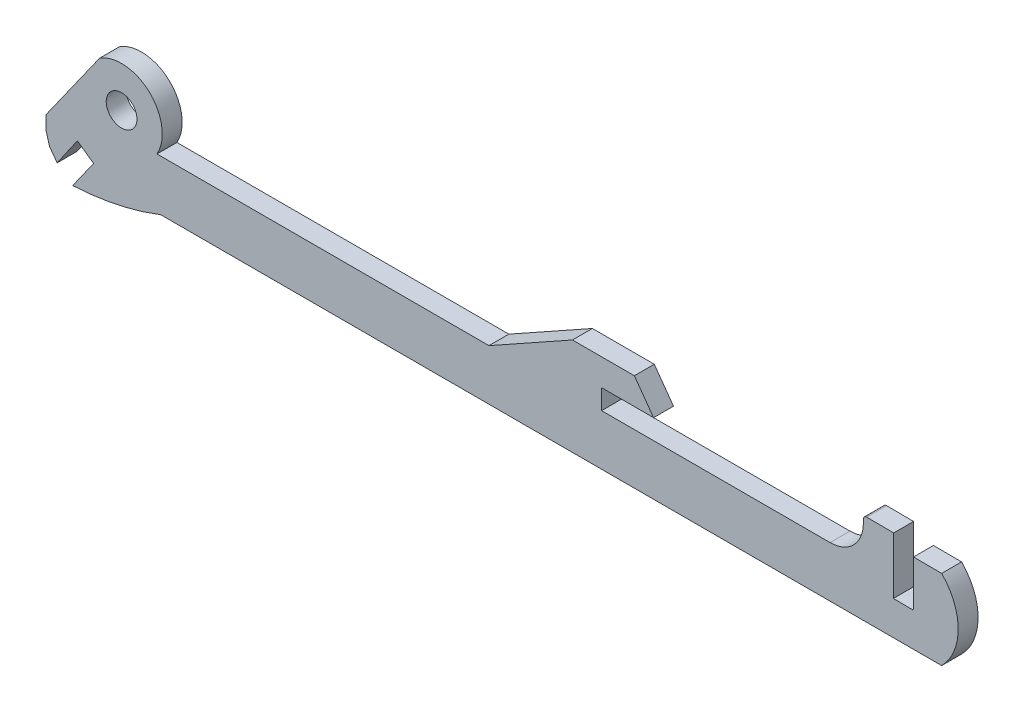
ISO-10303-21;
HEADER;
FILE_DESCRIPTION(('STEP AP214'),'2;1');
FILE_NAME('part.step','',(''),(''),'','','');
FILE_SCHEMA(('AUTOMOTIVE_DESIGN { 1 0 10303 214 1 1 1 1 }'));
ENDSEC;
DATA;
#1=APPLICATION_CONTEXT('core data for automotive mechanical design processes');
#2=APPLICATION_PROTOCOL_DEFINITION('international standard','automotive_design',2000,#1);
#3=PRODUCT_CONTEXT('',#1,'mechanical');
#4=PRODUCT('Part','Part','',(#3));
#5=PRODUCT_RELATED_PRODUCT_CATEGORY('part','',(#4));
#6=PRODUCT_DEFINITION_FORMATION('','',#4);
#7=PRODUCT_DEFINITION_CONTEXT('part definition',#1,'design');
#8=PRODUCT_DEFINITION('design','',#6,#7);
#9=PRODUCT_DEFINITION_SHAPE('','',#8);
#10=(LENGTH_UNIT() NAMED_UNIT(*) SI_UNIT(.MILLI.,.METRE.));
#11=(NAMED_UNIT(*) PLANE_ANGLE_UNIT() SI_UNIT($,.RADIAN.));
#12=(NAMED_UNIT(*) SI_UNIT($,.STERADIAN.) SOLID_ANGLE_UNIT());
#13=UNCERTAINTY_MEASURE_WITH_UNIT(LENGTH_MEASURE(1.E-05),#10,'distance_accuracy_value','');
#14=(GEOMETRIC_REPRESENTATION_CONTEXT(3) GLOBAL_UNCERTAINTY_ASSIGNED_CONTEXT((#13)) GLOBAL_UNIT_ASSIGNED_CONTEXT((#10,
#11,#12)) REPRESENTATION_CONTEXT('',''));
#15=CARTESIAN_POINT('',(0.,0.,0.));
#16=DIRECTION('',(0.,0.,1.));
#17=DIRECTION('',(1.,0.,0.));
#18=AXIS2_PLACEMENT_3D('',#15,#16,#17);
#19=CARTESIAN_POINT('',(1249.29913279827,-100.717822078419,3.));
#20=DIRECTION('',(0.,0.,-1.));
#21=DIRECTION('',(-1.,0.,0.));
#22=AXIS2_PLACEMENT_3D('',#19,#20,#21);
#23=PLANE('',#22);
#24=DIRECTION('',(0.00562127235781514,-0.999984200523728,0.));
#25=VECTOR('',#24,1.);
#26=CARTESIAN_POINT('',(1237.9238014744,-109.055713836434,3.));
#27=LINE('',#26,#25);
#28=CARTESIAN_POINT('',(1237.91205130226,-106.96544214322,3.));
#29=VERTEX_POINT('',#28);
#30=CARTESIAN_POINT('',(1237.9238014744,-109.055713836434,3.));
#31=VERTEX_POINT('',#30);
#32=EDGE_CURVE('E286',#29,#31,#27,.T.);
#33=ORIENTED_EDGE('',*,*,#32,.T.);
#34=DIRECTION('',(0.281544310526475,-0.959548227662462,0.));
#35=VECTOR('',#34,1.);
#36=CARTESIAN_POINT('',(1238.46032272712,-110.884264433615,3.));
#37=LINE('',#36,#35);
#38=CARTESIAN_POINT('',(1238.46032272712,-110.884264433615,3.));
#39=VERTEX_POINT('',#38);
#40=EDGE_CURVE('E225',#31,#39,#37,.T.);
#41=ORIENTED_EDGE('',*,*,#40,.T.);
#42=DIRECTION('',(0.594148336046172,-0.80435549029864,0.));
#43=VECTOR('',#42,1.);
#44=CARTESIAN_POINT('',(1239.59169644422,-112.415913359857,3.));
#45=LINE('',#44,#43);
#46=CARTESIAN_POINT('',(1239.59169644422,-112.415913359857,3.));
#47=VERTEX_POINT('',#46);
#48=EDGE_CURVE('E289',#39,#47,#45,.T.);
#49=ORIENTED_EDGE('',*,*,#48,.T.);
#50=DIRECTION('',(0.568869517770941,0.82242779120787,0.));
#51=VECTOR('',#50,1.);
#52=CARTESIAN_POINT('',(1242.63666962349,-108.013725357363,3.));
#53=LINE('',#52,#51);
#54=CARTESIAN_POINT('',(1242.63666962349,-108.013725357363,3.));
#55=VERTEX_POINT('',#54);
#56=EDGE_CURVE('E291',#47,#55,#53,.T.);
#57=ORIENTED_EDGE('',*,*,#56,.T.);
#58=DIRECTION('',(0.81647452991787,-0.57738145276359,0.));
#59=VECTOR('',#58,1.);
#60=CARTESIAN_POINT('',(1245.08609321325,-109.745869715654,3.));
#61=LINE('',#60,#59);
#62=CARTESIAN_POINT('',(1245.08609321325,-109.745869715654,3.));
#63=VERTEX_POINT('',#62);
#64=EDGE_CURVE('E293',#55,#63,#61,.T.);
#65=ORIENTED_EDGE('',*,*,#64,.T.);
#66=DIRECTION('',(-0.577381452763583,-0.816474529917874,0.));
#67=VECTOR('',#66,1.);
#68=CARTESIAN_POINT('',(1241.93611115172,-114.200256171309,3.));
#69=LINE('',#68,#67);
#70=CARTESIAN_POINT('',(1241.93611115172,-114.200256171309,3.));
#71=VERTEX_POINT('',#70);
#72=EDGE_CURVE('E295',#63,#71,#69,.T.);
#73=ORIENTED_EDGE('',*,*,#72,.T.);
#74=CARTESIAN_POINT('',(1240.12442524358,-73.1446000820579,3.));
#75=DIRECTION('',(0.,0.,1.));
#76=DIRECTION('',(-1.,0.,0.));
#77=AXIS2_PLACEMENT_3D('',#74,#75,#76);
#78=CIRCLE('',#77,41.0956092879596);
#79=CARTESIAN_POINT('',(1255.17955346671,-111.383222140571,3.));
#80=VERTEX_POINT('',#79);
#81=EDGE_CURVE('E297',#71,#80,#78,.T.);
#82=ORIENTED_EDGE('',*,*,#81,.T.);
#83=DIRECTION('',(1.,0.,0.));
#84=VECTOR('',#83,1.);
#85=CARTESIAN_POINT('',(1372.85593511088,-111.383222140572,3.));
#86=LINE('',#85,#84);
#87=CARTESIAN_POINT('',(1372.85593511088,-111.383222140572,3.));
#88=VERTEX_POINT('',#87);
#89=EDGE_CURVE('E299',#80,#88,#86,.T.);
#90=ORIENTED_EDGE('',*,*,#89,.T.);
#91=CARTESIAN_POINT('',(1366.83954740942,-105.36638446055,3.));
#92=DIRECTION('',(0.,0.,1.));
#93=DIRECTION('',(-1.,0.,0.));
#94=AXIS2_PLACEMENT_3D('',#91,#92,#93);
#95=CIRCLE('',#94,8.50877527273733);
#96=CARTESIAN_POINT('',(1372.85638508944,-99.3499967590952,3.));
#97=VERTEX_POINT('',#96);
#98=EDGE_CURVE('E301',#88,#97,#95,.T.);
#99=ORIENTED_EDGE('',*,*,#98,.T.);
#100=DIRECTION('',(-0.999980087028899,0.00631074842441065,0.));
#101=VECTOR('',#100,1.);
#102=CARTESIAN_POINT('',(1368.62014239532,-99.3232623648266,3.));
#103=LINE('',#102,#101);
#104=CARTESIAN_POINT('',(1368.62014239532,-99.3232623648266,3.));
#105=VERTEX_POINT('',#104);
#106=EDGE_CURVE('E303',#97,#105,#103,.T.);
#107=ORIENTED_EDGE('',*,*,#106,.T.);
#108=DIRECTION('',(-0.0063107484244119,-0.999980087028899,0.));
#109=VECTOR('',#108,1.);
#110=CARTESIAN_POINT('',(1368.62014239532,-99.3232623648266,3.));
#111=LINE('',#110,#109);
#112=CARTESIAN_POINT('',(1368.57623781168,-106.280235834852,3.));
#113=VERTEX_POINT('',#112);
#114=EDGE_CURVE('E305',#105,#113,#111,.T.);
#115=ORIENTED_EDGE('',*,*,#114,.T.);
#116=DIRECTION('',(-0.999980087028899,0.00631074842441552,0.));
#117=VECTOR('',#116,1.);
#118=CARTESIAN_POINT('',(1365.57623781168,-106.261303212574,3.));
#119=LINE('',#118,#117);
#120=CARTESIAN_POINT('',(1365.57623781168,-106.261303212574,3.));
#121=VERTEX_POINT('',#120);
#122=EDGE_CURVE('E307',#113,#121,#119,.T.);
#123=ORIENTED_EDGE('',*,*,#122,.T.);
#124=DIRECTION('',(0.00631074842442426,0.999980087028899,0.));
#125=VECTOR('',#124,1.);
#126=CARTESIAN_POINT('',(1365.63036840998,-97.6839496630379,3.));
#127=LINE('',#126,#125);
#128=CARTESIAN_POINT('',(1365.63036840998,-97.6839496630379,3.));
#129=VERTEX_POINT('',#128);
#130=EDGE_CURVE('E309',#121,#129,#127,.T.);
#131=ORIENTED_EDGE('',*,*,#130,.T.);
#132=DIRECTION('',(-0.999980087028899,0.00631074842441526,0.));
#133=VECTOR('',#132,1.);
#134=CARTESIAN_POINT('',(1361.56568395741,-97.6582979512313,3.));
#135=LINE('',#134,#133);
#136=CARTESIAN_POINT('',(1361.56568395741,-97.6582979512312,3.));
#137=VERTEX_POINT('',#136);
#138=EDGE_CURVE('E311',#129,#137,#135,.T.);
#139=ORIENTED_EDGE('',*,*,#138,.T.);
#140=CARTESIAN_POINT('',(1361.5625285832,-98.1582879947458,3.));
#141=DIRECTION('',(0.,0.,1.));
#142=DIRECTION('',(-1.,0.,0.));
#143=AXIS2_PLACEMENT_3D('',#140,#141,#142);
#144=CIRCLE('',#143,0.500000000000082);
#145=CARTESIAN_POINT('',(1361.0625285832,-98.1582879947458,3.));
#146=VERTEX_POINT('',#145);
#147=EDGE_CURVE('E313',#137,#146,#144,.T.);
#148=ORIENTED_EDGE('',*,*,#147,.T.);
#149=DIRECTION('',(0.,-1.,0.));
#150=VECTOR('',#149,1.);
#151=CARTESIAN_POINT('',(1361.0625285832,-98.4776898423774,3.));
#152=LINE('',#151,#150);
#153=CARTESIAN_POINT('',(1361.0625285832,-98.4776898423774,3.));
#154=VERTEX_POINT('',#153);
#155=EDGE_CURVE('E315',#146,#154,#152,.T.);
#156=ORIENTED_EDGE('',*,*,#155,.T.);
#157=DIRECTION('',(-0.0379292699595428,-0.999280426347047,0.));
#158=VECTOR('',#157,1.);
#159=CARTESIAN_POINT('',(1361.04558813768,-98.9240009800915,3.));
#160=LINE('',#159,#158);
#161=CARTESIAN_POINT('',(1361.04558813768,-98.9240009800915,3.));
#162=VERTEX_POINT('',#161);
#163=EDGE_CURVE('E317',#154,#162,#160,.T.);
#164=ORIENTED_EDGE('',*,*,#163,.T.);
#165=CARTESIAN_POINT('',(1356.04918600594,-98.734354630292,3.));
#166=DIRECTION('',(0.,0.,-1.));
#167=DIRECTION('',(1.,0.,0.));
#168=AXIS2_PLACEMENT_3D('',#165,#166,#167);
#169=CIRCLE('',#168,5.00000000000004);
#170=CARTESIAN_POINT('',(1356.04918600594,-103.734354630292,3.));
#171=VERTEX_POINT('',#170);
#172=EDGE_CURVE('E319',#162,#171,#169,.T.);
#173=ORIENTED_EDGE('',*,*,#172,.T.);
#174=DIRECTION('',(-1.,0.,0.));
#175=VECTOR('',#174,1.);
#176=CARTESIAN_POINT('',(1321.62054351915,-103.734354630292,3.));
#177=LINE('',#176,#175);
#178=CARTESIAN_POINT('',(1321.62054351915,-103.734354630292,3.));
#179=VERTEX_POINT('',#178);
#180=EDGE_CURVE('E321',#171,#179,#177,.T.);
#181=ORIENTED_EDGE('',*,*,#180,.T.);
#182=DIRECTION('',(0.,1.,0.));
#183=VECTOR('',#182,1.);
#184=CARTESIAN_POINT('',(1321.62054351915,-100.734354630292,3.));
#185=LINE('',#184,#183);
#186=CARTESIAN_POINT('',(1321.62054351915,-100.734354630292,3.));
#187=VERTEX_POINT('',#186);
#188=EDGE_CURVE('E323',#179,#187,#185,.T.);
#189=ORIENTED_EDGE('',*,*,#188,.T.);
#190=DIRECTION('',(1.,0.,0.));
#191=VECTOR('',#190,1.);
#192=CARTESIAN_POINT('',(1329.4523890128,-100.734354630292,3.));
#193=LINE('',#192,#191);
#194=CARTESIAN_POINT('',(1329.4523890128,-100.734354630292,3.));
#195=VERTEX_POINT('',#194);
#196=EDGE_CURVE('E325',#187,#195,#193,.T.);
#197=ORIENTED_EDGE('',*,*,#196,.T.);
#198=DIRECTION('',(-0.583216661111153,0.812316641588954,0.));
#199=VECTOR('',#198,1.);
#200=CARTESIAN_POINT('',(1326.56081780387,-96.7069123948891,3.));
#201=LINE('',#200,#199);
#202=CARTESIAN_POINT('',(1326.56081780387,-96.7069123948891,3.));
#203=VERTEX_POINT('',#202);
#204=EDGE_CURVE('E327',#195,#203,#201,.T.);
#205=ORIENTED_EDGE('',*,*,#204,.T.);
#206=DIRECTION('',(-1.,0.,0.));
#207=VECTOR('',#206,1.);
#208=CARTESIAN_POINT('',(1317.22732187553,-96.7069123948894,3.));
#209=LINE('',#208,#207);
#210=CARTESIAN_POINT('',(1317.22732187553,-96.7069123948894,3.));
#211=VERTEX_POINT('',#210);
#212=EDGE_CURVE('E329',#203,#211,#209,.T.);
#213=ORIENTED_EDGE('',*,*,#212,.T.);
#214=DIRECTION('',(-0.872913314261698,-0.487875338364892,0.));
#215=VECTOR('',#214,1.);
#216=CARTESIAN_POINT('',(1304.65372487215,-103.734354630292,3.));
#217=LINE('',#216,#215);
#218=CARTESIAN_POINT('',(1304.65372487215,-103.734354630292,3.));
#219=VERTEX_POINT('',#218);
#220=EDGE_CURVE('E331',#211,#219,#217,.T.);
#221=ORIENTED_EDGE('',*,*,#220,.T.);
#222=DIRECTION('',(-1.,0.,0.));
#223=VECTOR('',#222,1.);
#224=CARTESIAN_POINT('',(1254.63436473097,-103.734354630292,3.));
#225=LINE('',#224,#223);
#226=CARTESIAN_POINT('',(1254.63436473097,-103.734354630292,3.));
#227=VERTEX_POINT('',#226);
#228=EDGE_CURVE('E333',#219,#227,#225,.T.);
#229=ORIENTED_EDGE('',*,*,#228,.T.);
#230=CARTESIAN_POINT('',(1249.29913279827,-100.717822078419,3.));
#231=DIRECTION('',(0.,0.,1.));
#232=DIRECTION('',(-1.,0.,0.));
#233=AXIS2_PLACEMENT_3D('',#230,#231,#232);
#234=CIRCLE('',#233,6.12896144646709);
#235=CARTESIAN_POINT('',(1245.98749698581,-95.5605711966088,3.));
#236=VERTEX_POINT('',#235);
#237=EDGE_CURVE('E52',#227,#236,#234,.T.);
#238=ORIENTED_EDGE('',*,*,#237,.T.);
#239=DIRECTION('',(-0.577874160731018,-0.816125881441963,0.));
#240=VECTOR('',#239,1.);
#241=CARTESIAN_POINT('',(1237.91205130226,-106.96544214322,3.));
#242=LINE('',#241,#240);
#243=EDGE_CURVE('E47',#236,#29,#242,.T.);
#244=ORIENTED_EDGE('',*,*,#243,.T.);
#245=EDGE_LOOP('',(#33,#41,#49,#57,#65,#73,#82,#90,#99,#107,#115,#123,#131,#139,#148,#156,#164,
#173,#181,#189,#197,#205,#213,#221,#229,#238,#244));
#246=FACE_BOUND('',#245,.T.);
#247=CARTESIAN_POINT('',(1249.29913279827,-100.717822078419,3.));
#248=DIRECTION('',(0.,0.,1.));
#249=DIRECTION('',(1.,0.,0.));
#250=AXIS2_PLACEMENT_3D('',#247,#248,#249);
#251=CIRCLE('',#250,2.31465382685576);
#252=CARTESIAN_POINT('',(1251.61378662512,-100.717822078419,3.));
#253=VERTEX_POINT('',#252);
#254=EDGE_CURVE('E230',#253,#253,#251,.T.);
#255=ORIENTED_EDGE('',*,*,#254,.F.);
#256=EDGE_LOOP('',(#255));
#257=FACE_BOUND('',#256,.T.);
#258=ADVANCED_FACE('F32',(#246,#257),#23,.F.);
#259=CARTESIAN_POINT('',(1249.29913279827,-100.717822078419,0.));
#260=DIRECTION('',(0.,0.,-1.));
#261=DIRECTION('',(-1.,0.,0.));
#262=AXIS2_PLACEMENT_3D('',#259,#260,#261);
#263=PLANE('',#262);
#264=DIRECTION('',(0.00562127235781514,-0.999984200523728,0.));
#265=VECTOR('',#264,1.);
#266=CARTESIAN_POINT('',(1237.9238014744,-109.055713836434,0.));
#267=LINE('',#266,#265);
#268=CARTESIAN_POINT('',(1237.91205130226,-106.96544214322,0.));
#269=VERTEX_POINT('',#268);
#270=CARTESIAN_POINT('',(1237.9238014744,-109.055713836434,0.));
#271=VERTEX_POINT('',#270);
#272=EDGE_CURVE('E216',#269,#271,#267,.T.);
#273=ORIENTED_EDGE('',*,*,#272,.F.);
#274=DIRECTION('',(-0.577874160731018,-0.816125881441963,0.));
#275=VECTOR('',#274,1.);
#276=CARTESIAN_POINT('',(1237.91205130226,-106.96544214322,0.));
#277=LINE('',#276,#275);
#278=CARTESIAN_POINT('',(1245.98749698581,-95.5605711966088,0.));
#279=VERTEX_POINT('',#278);
#280=EDGE_CURVE('E284',#279,#269,#277,.T.);
#281=ORIENTED_EDGE('',*,*,#280,.F.);
#282=CARTESIAN_POINT('',(1249.29913279827,-100.717822078419,0.));
#283=DIRECTION('',(0.,0.,1.));
#284=DIRECTION('',(-1.,0.,0.));
#285=AXIS2_PLACEMENT_3D('',#282,#283,#284);
#286=CIRCLE('',#285,6.12896144646709);
#287=CARTESIAN_POINT('',(1254.63436473097,-103.734354630292,0.));
#288=VERTEX_POINT('',#287);
#289=EDGE_CURVE('E282',#288,#279,#286,.T.);
#290=ORIENTED_EDGE('',*,*,#289,.F.);
#291=DIRECTION('',(-1.,0.,0.));
#292=VECTOR('',#291,1.);
#293=CARTESIAN_POINT('',(1254.63436473097,-103.734354630292,0.));
#294=LINE('',#293,#292);
#295=CARTESIAN_POINT('',(1304.65372487215,-103.734354630292,0.));
#296=VERTEX_POINT('',#295);
#297=EDGE_CURVE('E280',#296,#288,#294,.T.);
#298=ORIENTED_EDGE('',*,*,#297,.F.);
#299=DIRECTION('',(-0.872913314261698,-0.487875338364892,0.));
#300=VECTOR('',#299,1.);
#301=CARTESIAN_POINT('',(1304.65372487215,-103.734354630292,0.));
#302=LINE('',#301,#300);
#303=CARTESIAN_POINT('',(1317.22732187553,-96.7069123948894,0.));
#304=VERTEX_POINT('',#303);
#305=EDGE_CURVE('E278',#304,#296,#302,.T.);
#306=ORIENTED_EDGE('',*,*,#305,.F.);
#307=DIRECTION('',(-1.,0.,0.));
#308=VECTOR('',#307,1.);
#309=CARTESIAN_POINT('',(1317.22732187553,-96.7069123948894,0.));
#310=LINE('',#309,#308);
#311=CARTESIAN_POINT('',(1326.56081780387,-96.7069123948891,0.));
#312=VERTEX_POINT('',#311);
#313=EDGE_CURVE('E276',#312,#304,#310,.T.);
#314=ORIENTED_EDGE('',*,*,#313,.F.);
#315=DIRECTION('',(-0.583216661111153,0.812316641588954,0.));
#316=VECTOR('',#315,1.);
#317=CARTESIAN_POINT('',(1326.56081780387,-96.7069123948891,0.));
#318=LINE('',#317,#316);
#319=CARTESIAN_POINT('',(1329.4523890128,-100.734354630292,0.));
#320=VERTEX_POINT('',#319);
#321=EDGE_CURVE('E274',#320,#312,#318,.T.);
#322=ORIENTED_EDGE('',*,*,#321,.F.);
#323=DIRECTION('',(1.,0.,0.));
#324=VECTOR('',#323,1.);
#325=CARTESIAN_POINT('',(1329.4523890128,-100.734354630292,0.));
#326=LINE('',#325,#324);
#327=CARTESIAN_POINT('',(1321.62054351915,-100.734354630292,0.));
#328=VERTEX_POINT('',#327);
#329=EDGE_CURVE('E272',#328,#320,#326,.T.);
#330=ORIENTED_EDGE('',*,*,#329,.F.);
#331=DIRECTION('',(0.,1.,0.));
#332=VECTOR('',#331,1.);
#333=CARTESIAN_POINT('',(1321.62054351915,-100.734354630292,0.));
#334=LINE('',#333,#332);
#335=CARTESIAN_POINT('',(1321.62054351915,-103.734354630292,0.));
#336=VERTEX_POINT('',#335);
#337=EDGE_CURVE('E270',#336,#328,#334,.T.);
#338=ORIENTED_EDGE('',*,*,#337,.F.);
#339=DIRECTION('',(-1.,0.,0.));
#340=VECTOR('',#339,1.);
#341=CARTESIAN_POINT('',(1321.62054351915,-103.734354630292,0.));
#342=LINE('',#341,#340);
#343=CARTESIAN_POINT('',(1356.04918600594,-103.734354630292,0.));
#344=VERTEX_POINT('',#343);
#345=EDGE_CURVE('E268',#344,#336,#342,.T.);
#346=ORIENTED_EDGE('',*,*,#345,.F.);
#347=CARTESIAN_POINT('',(1356.04918600594,-98.734354630292,0.));
#348=DIRECTION('',(0.,0.,-1.));
#349=DIRECTION('',(1.,0.,0.));
#350=AXIS2_PLACEMENT_3D('',#347,#348,#349);
#351=CIRCLE('',#350,5.00000000000004);
#352=CARTESIAN_POINT('',(1361.04558813768,-98.9240009800915,0.));
#353=VERTEX_POINT('',#352);
#354=EDGE_CURVE('E266',#353,#344,#351,.T.);
#355=ORIENTED_EDGE('',*,*,#354,.F.);
#356=DIRECTION('',(-0.0379292699595428,-0.999280426347047,0.));
#357=VECTOR('',#356,1.);
#358=CARTESIAN_POINT('',(1361.04558813768,-98.9240009800915,0.));
#359=LINE('',#358,#357);
#360=CARTESIAN_POINT('',(1361.0625285832,-98.4776898423774,0.));
#361=VERTEX_POINT('',#360);
#362=EDGE_CURVE('E264',#361,#353,#359,.T.);
#363=ORIENTED_EDGE('',*,*,#362,.F.);
#364=DIRECTION('',(0.,-1.,0.));
#365=VECTOR('',#364,1.);
#366=CARTESIAN_POINT('',(1361.0625285832,-98.4776898423774,0.));
#367=LINE('',#366,#365);
#368=CARTESIAN_POINT('',(1361.0625285832,-98.1582879947458,0.));
#369=VERTEX_POINT('',#368);
#370=EDGE_CURVE('E262',#369,#361,#367,.T.);
#371=ORIENTED_EDGE('',*,*,#370,.F.);
#372=CARTESIAN_POINT('',(1361.5625285832,-98.1582879947458,0.));
#373=DIRECTION('',(0.,0.,1.));
#374=DIRECTION('',(-1.,0.,0.));
#375=AXIS2_PLACEMENT_3D('',#372,#373,#374);
#376=CIRCLE('',#375,0.500000000000082);
#377=CARTESIAN_POINT('',(1361.56568395741,-97.6582979512312,0.));
#378=VERTEX_POINT('',#377);
#379=EDGE_CURVE('E260',#378,#369,#376,.T.);
#380=ORIENTED_EDGE('',*,*,#379,.F.);
#381=DIRECTION('',(-0.999980087028899,0.00631074842441526,0.));
#382=VECTOR('',#381,1.);
#383=CARTESIAN_POINT('',(1361.56568395741,-97.6582979512313,0.));
#384=LINE('',#383,#382);
#385=CARTESIAN_POINT('',(1365.63036840998,-97.6839496630379,0.));
#386=VERTEX_POINT('',#385);
#387=EDGE_CURVE('E258',#386,#378,#384,.T.);
#388=ORIENTED_EDGE('',*,*,#387,.F.);
#389=DIRECTION('',(0.00631074842442426,0.999980087028899,0.));
#390=VECTOR('',#389,1.);
#391=CARTESIAN_POINT('',(1365.63036840998,-97.6839496630379,0.));
#392=LINE('',#391,#390);
#393=CARTESIAN_POINT('',(1365.57623781168,-106.261303212574,0.));
#394=VERTEX_POINT('',#393);
#395=EDGE_CURVE('E256',#394,#386,#392,.T.);
#396=ORIENTED_EDGE('',*,*,#395,.F.);
#397=DIRECTION('',(-0.999980087028899,0.00631074842441552,0.));
#398=VECTOR('',#397,1.);
#399=CARTESIAN_POINT('',(1365.57623781168,-106.261303212574,0.));
#400=LINE('',#399,#398);
#401=CARTESIAN_POINT('',(1368.57623781168,-106.280235834852,0.));
#402=VERTEX_POINT('',#401);
#403=EDGE_CURVE('E254',#402,#394,#400,.T.);
#404=ORIENTED_EDGE('',*,*,#403,.F.);
#405=DIRECTION('',(-0.0063107484244119,-0.999980087028899,0.));
#406=VECTOR('',#405,1.);
#407=CARTESIAN_POINT('',(1368.62014239532,-99.3232623648266,0.));
#408=LINE('',#407,#406);
#409=CARTESIAN_POINT('',(1368.62014239532,-99.3232623648266,0.));
#410=VERTEX_POINT('',#409);
#411=EDGE_CURVE('E252',#410,#402,#408,.T.);
#412=ORIENTED_EDGE('',*,*,#411,.F.);
#413=DIRECTION('',(-0.999980087028899,0.00631074842441065,0.));
#414=VECTOR('',#413,1.);
#415=CARTESIAN_POINT('',(1368.62014239532,-99.3232623648266,0.));
#416=LINE('',#415,#414);
#417=CARTESIAN_POINT('',(1372.85638508944,-99.3499967590952,0.));
#418=VERTEX_POINT('',#417);
#419=EDGE_CURVE('E250',#418,#410,#416,.T.);
#420=ORIENTED_EDGE('',*,*,#419,.F.);
#421=CARTESIAN_POINT('',(1366.83954740942,-105.36638446055,0.));
#422=DIRECTION('',(0.,0.,1.));
#423=DIRECTION('',(-1.,0.,0.));
#424=AXIS2_PLACEMENT_3D('',#421,#422,#423);
#425=CIRCLE('',#424,8.50877527273733);
#426=CARTESIAN_POINT('',(1372.85593511088,-111.383222140572,0.));
#427=VERTEX_POINT('',#426);
#428=EDGE_CURVE('E248',#427,#418,#425,.T.);
#429=ORIENTED_EDGE('',*,*,#428,.F.);
#430=DIRECTION('',(1.,0.,0.));
#431=VECTOR('',#430,1.);
#432=CARTESIAN_POINT('',(1372.85593511088,-111.383222140572,0.));
#433=LINE('',#432,#431);
#434=CARTESIAN_POINT('',(1255.17955346671,-111.383222140571,0.));
#435=VERTEX_POINT('',#434);
#436=EDGE_CURVE('E246',#435,#427,#433,.T.);
#437=ORIENTED_EDGE('',*,*,#436,.F.);
#438=CARTESIAN_POINT('',(1240.12442524358,-73.1446000820579,0.));
#439=DIRECTION('',(0.,0.,1.));
#440=DIRECTION('',(-1.,0.,0.));
#441=AXIS2_PLACEMENT_3D('',#438,#439,#440);
#442=CIRCLE('',#441,41.0956092879596);
#443=CARTESIAN_POINT('',(1241.93611115172,-114.200256171309,0.));
#444=VERTEX_POINT('',#443);
#445=EDGE_CURVE('E244',#444,#435,#442,.T.);
#446=ORIENTED_EDGE('',*,*,#445,.F.);
#447=DIRECTION('',(-0.577381452763583,-0.816474529917874,0.));
#448=VECTOR('',#447,1.);
#449=CARTESIAN_POINT('',(1241.93611115172,-114.200256171309,0.));
#450=LINE('',#449,#448);
#451=CARTESIAN_POINT('',(1245.08609321325,-109.745869715654,0.));
#452=VERTEX_POINT('',#451);
#453=EDGE_CURVE('E242',#452,#444,#450,.T.);
#454=ORIENTED_EDGE('',*,*,#453,.F.);
#455=DIRECTION('',(0.81647452991787,-0.57738145276359,0.));
#456=VECTOR('',#455,1.);
#457=CARTESIAN_POINT('',(1245.08609321325,-109.745869715654,0.));
#458=LINE('',#457,#456);
#459=CARTESIAN_POINT('',(1242.63666962349,-108.013725357363,0.));
#460=VERTEX_POINT('',#459);
#461=EDGE_CURVE('E240',#460,#452,#458,.T.);
#462=ORIENTED_EDGE('',*,*,#461,.F.);
#463=DIRECTION('',(0.568869517770941,0.82242779120787,0.));
#464=VECTOR('',#463,1.);
#465=CARTESIAN_POINT('',(1242.63666962349,-108.013725357363,0.));
#466=LINE('',#465,#464);
#467=CARTESIAN_POINT('',(1239.59169644422,-112.415913359857,0.));
#468=VERTEX_POINT('',#467);
#469=EDGE_CURVE('E238',#468,#460,#466,.T.);
#470=ORIENTED_EDGE('',*,*,#469,.F.);
#471=DIRECTION('',(0.594148336046172,-0.80435549029864,0.));
#472=VECTOR('',#471,1.);
#473=CARTESIAN_POINT('',(1239.59169644422,-112.415913359857,0.));
#474=LINE('',#473,#472);
#475=CARTESIAN_POINT('',(1238.46032272712,-110.884264433615,0.));
#476=VERTEX_POINT('',#475);
#477=EDGE_CURVE('E218',#476,#468,#474,.T.);
#478=ORIENTED_EDGE('',*,*,#477,.F.);
#479=DIRECTION('',(0.281544310526475,-0.959548227662462,0.));
#480=VECTOR('',#479,1.);
#481=CARTESIAN_POINT('',(1238.46032272712,-110.884264433615,0.));
#482=LINE('',#481,#480);
#483=EDGE_CURVE('E211',#271,#476,#482,.T.);
#484=ORIENTED_EDGE('',*,*,#483,.F.);
#485=EDGE_LOOP('',(#273,#281,#290,#298,#306,#314,#322,#330,#338,#346,#355,#363,#371,#380,#388,
#396,#404,#412,#420,#429,#437,#446,#454,#462,#470,#478,#484));
#486=FACE_BOUND('',#485,.T.);
#487=CARTESIAN_POINT('',(1249.29913279827,-100.717822078419,0.));
#488=DIRECTION('',(0.,0.,1.));
#489=DIRECTION('',(1.,0.,0.));
#490=AXIS2_PLACEMENT_3D('',#487,#488,#489);
#491=CIRCLE('',#490,2.31465382685576);
#492=CARTESIAN_POINT('',(1251.61378662512,-100.717822078419,0.));
#493=VERTEX_POINT('',#492);
#494=EDGE_CURVE('E233',#493,#493,#491,.T.);
#495=ORIENTED_EDGE('',*,*,#494,.T.);
#496=EDGE_LOOP('',(#495));
#497=FACE_BOUND('',#496,.T.);
#498=ADVANCED_FACE('F212',(#486,#497),#263,.T.);
#499=CARTESIAN_POINT('',(1237.9238014744,-109.055713836434,3.));
#500=DIRECTION('',(0.999984200523728,0.00562127235781514,0.));
#501=DIRECTION('',(-0.00562127235781514,0.999984200523728,0.));
#502=AXIS2_PLACEMENT_3D('',#499,#500,#501);
#503=PLANE('',#502);
#504=ORIENTED_EDGE('',*,*,#272,.T.);
#505=DIRECTION('',(0.,0.,-1.));
#506=VECTOR('',#505,1.);
#507=CARTESIAN_POINT('',(1237.9238014744,-109.055713836434,3.));
#508=LINE('',#507,#506);
#509=EDGE_CURVE('E11',#31,#271,#508,.T.);
#510=ORIENTED_EDGE('',*,*,#509,.F.);
#511=ORIENTED_EDGE('',*,*,#32,.F.);
#512=DIRECTION('',(0.,0.,-1.));
#513=VECTOR('',#512,1.);
#514=CARTESIAN_POINT('',(1237.91205130226,-106.96544214322,3.));
#515=LINE('',#514,#513);
#516=EDGE_CURVE('E229',#29,#269,#515,.T.);
#517=ORIENTED_EDGE('',*,*,#516,.T.);
#518=EDGE_LOOP('',(#504,#510,#511,#517));
#519=FACE_BOUND('',#518,.T.);
#520=ADVANCED_FACE('F34',(#519),#503,.F.);
#521=CARTESIAN_POINT('',(1238.46032272712,-110.884264433615,3.));
#522=DIRECTION('',(0.959548227662462,0.281544310526475,0.));
#523=DIRECTION('',(-0.281544310526475,0.959548227662462,0.));
#524=AXIS2_PLACEMENT_3D('',#521,#522,#523);
#525=PLANE('',#524);
#526=ORIENTED_EDGE('',*,*,#483,.T.);
#527=DIRECTION('',(0.,0.,-1.));
#528=VECTOR('',#527,1.);
#529=CARTESIAN_POINT('',(1238.46032272712,-110.884264433615,3.));
#530=LINE('',#529,#528);
#531=EDGE_CURVE('E40',#39,#476,#530,.T.);
#532=ORIENTED_EDGE('',*,*,#531,.F.);
#533=ORIENTED_EDGE('',*,*,#40,.F.);
#534=ORIENTED_EDGE('',*,*,#509,.T.);
#535=EDGE_LOOP('',(#526,#532,#533,#534));
#536=FACE_BOUND('',#535,.T.);
#537=ADVANCED_FACE('F224',(#536),#525,.F.);
#538=CARTESIAN_POINT('',(1239.59169644422,-112.415913359857,3.));
#539=DIRECTION('',(0.80435549029864,0.594148336046172,0.));
#540=DIRECTION('',(-0.594148336046172,0.80435549029864,0.));
#541=AXIS2_PLACEMENT_3D('',#538,#539,#540);
#542=PLANE('',#541);
#543=ORIENTED_EDGE('',*,*,#477,.T.);
#544=DIRECTION('',(0.,0.,-1.));
#545=VECTOR('',#544,1.);
#546=CARTESIAN_POINT('',(1239.59169644422,-112.415913359857,3.));
#547=LINE('',#546,#545);
#548=EDGE_CURVE('E407',#47,#468,#547,.T.);
#549=ORIENTED_EDGE('',*,*,#548,.F.);
#550=ORIENTED_EDGE('',*,*,#48,.F.);
#551=ORIENTED_EDGE('',*,*,#531,.T.);
#552=EDGE_LOOP('',(#543,#549,#550,#551));
#553=FACE_BOUND('',#552,.T.);
#554=ADVANCED_FACE('F411',(#553),#542,.F.);
#555=CARTESIAN_POINT('',(1242.63666962349,-108.013725357363,3.));
#556=DIRECTION('',(-0.822427791207871,0.568869517770941,0.));
#557=DIRECTION('',(-0.568869517770941,-0.822427791207871,0.));
#558=AXIS2_PLACEMENT_3D('',#555,#556,#557);
#559=PLANE('',#558);
#560=ORIENTED_EDGE('',*,*,#469,.T.);
#561=DIRECTION('',(0.,0.,-1.));
#562=VECTOR('',#561,1.);
#563=CARTESIAN_POINT('',(1242.63666962349,-108.013725357363,3.));
#564=LINE('',#563,#562);
#565=EDGE_CURVE('E404',#55,#460,#564,.T.);
#566=ORIENTED_EDGE('',*,*,#565,.F.);
#567=ORIENTED_EDGE('',*,*,#56,.F.);
#568=ORIENTED_EDGE('',*,*,#548,.T.);
#569=EDGE_LOOP('',(#560,#566,#567,#568));
#570=FACE_BOUND('',#569,.T.);
#571=ADVANCED_FACE('F419',(#570),#559,.F.);
#572=CARTESIAN_POINT('',(1245.08609321325,-109.745869715654,3.));
#573=DIRECTION('',(0.57738145276359,0.81647452991787,0.));
#574=DIRECTION('',(-0.81647452991787,0.57738145276359,0.));
#575=AXIS2_PLACEMENT_3D('',#572,#573,#574);
#576=PLANE('',#575);
#577=ORIENTED_EDGE('',*,*,#461,.T.);
#578=DIRECTION('',(0.,0.,-1.));
#579=VECTOR('',#578,1.);
#580=CARTESIAN_POINT('',(1245.08609321325,-109.745869715654,3.));
#581=LINE('',#580,#579);
#582=EDGE_CURVE('E401',#63,#452,#581,.T.);
#583=ORIENTED_EDGE('',*,*,#582,.F.);
#584=ORIENTED_EDGE('',*,*,#64,.F.);
#585=ORIENTED_EDGE('',*,*,#565,.T.);
#586=EDGE_LOOP('',(#577,#583,#584,#585));
#587=FACE_BOUND('',#586,.T.);
#588=ADVANCED_FACE('F422',(#587),#576,.F.);
#589=CARTESIAN_POINT('',(1241.93611115172,-114.200256171309,3.));
#590=DIRECTION('',(0.816474529917875,-0.577381452763583,0.));
#591=DIRECTION('',(0.577381452763583,0.816474529917875,0.));
#592=AXIS2_PLACEMENT_3D('',#589,#590,#591);
#593=PLANE('',#592);
#594=ORIENTED_EDGE('',*,*,#453,.T.);
#595=DIRECTION('',(0.,0.,-1.));
#596=VECTOR('',#595,1.);
#597=CARTESIAN_POINT('',(1241.93611115172,-114.200256171309,3.));
#598=LINE('',#597,#596);
#599=EDGE_CURVE('E398',#71,#444,#598,.T.);
#600=ORIENTED_EDGE('',*,*,#599,.F.);
#601=ORIENTED_EDGE('',*,*,#72,.F.);
#602=ORIENTED_EDGE('',*,*,#582,.T.);
#603=EDGE_LOOP('',(#594,#600,#601,#602));
#604=FACE_BOUND('',#603,.T.);
#605=ADVANCED_FACE('F427',(#604),#593,.F.);
#606=CARTESIAN_POINT('',(1240.12442524358,-73.1446000820579,3.));
#607=DIRECTION('',(0.,0.,-1.));
#608=DIRECTION('',(-1.,0.,0.));
#609=AXIS2_PLACEMENT_3D('',#606,#607,#608);
#610=CYLINDRICAL_SURFACE('',#609,41.0956092879596);
#611=ORIENTED_EDGE('',*,*,#445,.T.);
#612=DIRECTION('',(0.,0.,-1.));
#613=VECTOR('',#612,1.);
#614=CARTESIAN_POINT('',(1255.17955346671,-111.383222140571,3.));
#615=LINE('',#614,#613);
#616=EDGE_CURVE('E395',#80,#435,#615,.T.);
#617=ORIENTED_EDGE('',*,*,#616,.F.);
#618=ORIENTED_EDGE('',*,*,#81,.F.);
#619=ORIENTED_EDGE('',*,*,#599,.T.);
#620=EDGE_LOOP('',(#611,#617,#618,#619));
#621=FACE_BOUND('',#620,.T.);
#622=ADVANCED_FACE('F433',(#621),#610,.T.);
#623=CARTESIAN_POINT('',(1372.85593511088,-111.383222140572,3.));
#624=DIRECTION('',(0.,1.,0.));
#625=DIRECTION('',(-1.,0.,0.));
#626=AXIS2_PLACEMENT_3D('',#623,#624,#625);
#627=PLANE('',#626);
#628=ORIENTED_EDGE('',*,*,#436,.T.);
#629=DIRECTION('',(0.,0.,-1.));
#630=VECTOR('',#629,1.);
#631=CARTESIAN_POINT('',(1372.85593511088,-111.383222140572,3.));
#632=LINE('',#631,#630);
#633=EDGE_CURVE('E392',#88,#427,#632,.T.);
#634=ORIENTED_EDGE('',*,*,#633,.F.);
#635=ORIENTED_EDGE('',*,*,#89,.F.);
#636=ORIENTED_EDGE('',*,*,#616,.T.);
#637=EDGE_LOOP('',(#628,#634,#635,#636));
#638=FACE_BOUND('',#637,.T.);
#639=ADVANCED_FACE('F437',(#638),#627,.F.);
#640=CARTESIAN_POINT('',(1366.83954740942,-105.36638446055,3.));
#641=DIRECTION('',(0.,0.,-1.));
#642=DIRECTION('',(-1.,0.,0.));
#643=AXIS2_PLACEMENT_3D('',#640,#641,#642);
#644=CYLINDRICAL_SURFACE('',#643,8.50877527273733);
#645=ORIENTED_EDGE('',*,*,#428,.T.);
#646=DIRECTION('',(0.,0.,-1.));
#647=VECTOR('',#646,1.);
#648=CARTESIAN_POINT('',(1372.85638508944,-99.3499967590952,3.));
#649=LINE('',#648,#647);
#650=EDGE_CURVE('E389',#97,#418,#649,.T.);
#651=ORIENTED_EDGE('',*,*,#650,.F.);
#652=ORIENTED_EDGE('',*,*,#98,.F.);
#653=ORIENTED_EDGE('',*,*,#633,.T.);
#654=EDGE_LOOP('',(#645,#651,#652,#653));
#655=FACE_BOUND('',#654,.T.);
#656=ADVANCED_FACE('F442',(#655),#644,.T.);
#657=CARTESIAN_POINT('',(1368.62014239532,-99.3232623648266,3.));
#658=DIRECTION('',(-0.00631074842441065,-0.999980087028899,0.));
#659=DIRECTION('',(0.999980087028899,-0.00631074842441065,0.));
#660=AXIS2_PLACEMENT_3D('',#657,#658,#659);
#661=PLANE('',#660);
#662=ORIENTED_EDGE('',*,*,#419,.T.);
#663=DIRECTION('',(0.,0.,-1.));
#664=VECTOR('',#663,1.);
#665=CARTESIAN_POINT('',(1368.62014239532,-99.3232623648266,3.));
#666=LINE('',#665,#664);
#667=EDGE_CURVE('E386',#105,#410,#666,.T.);
#668=ORIENTED_EDGE('',*,*,#667,.F.);
#669=ORIENTED_EDGE('',*,*,#106,.F.);
#670=ORIENTED_EDGE('',*,*,#650,.T.);
#671=EDGE_LOOP('',(#662,#668,#669,#670));
#672=FACE_BOUND('',#671,.T.);
#673=ADVANCED_FACE('F448',(#672),#661,.F.);
#674=CARTESIAN_POINT('',(1368.62014239532,-99.3232623648266,3.));
#675=DIRECTION('',(0.999980087028899,-0.0063107484244119,0.));
#676=DIRECTION('',(0.0063107484244119,0.999980087028899,0.));
#677=AXIS2_PLACEMENT_3D('',#674,#675,#676);
#678=PLANE('',#677);
#679=ORIENTED_EDGE('',*,*,#411,.T.);
#680=DIRECTION('',(0.,0.,-1.));
#681=VECTOR('',#680,1.);
#682=CARTESIAN_POINT('',(1368.57623781168,-106.280235834852,3.));
#683=LINE('',#682,#681);
#684=EDGE_CURVE('E383',#113,#402,#683,.T.);
#685=ORIENTED_EDGE('',*,*,#684,.F.);
#686=ORIENTED_EDGE('',*,*,#114,.F.);
#687=ORIENTED_EDGE('',*,*,#667,.T.);
#688=EDGE_LOOP('',(#679,#685,#686,#687));
#689=FACE_BOUND('',#688,.T.);
#690=ADVANCED_FACE('F452',(#689),#678,.F.);
#691=CARTESIAN_POINT('',(1365.57623781168,-106.261303212574,3.));
#692=DIRECTION('',(-0.00631074842441552,-0.999980087028899,0.));
#693=DIRECTION('',(0.999980087028899,-0.00631074842441552,0.));
#694=AXIS2_PLACEMENT_3D('',#691,#692,#693);
#695=PLANE('',#694);
#696=ORIENTED_EDGE('',*,*,#403,.T.);
#697=DIRECTION('',(0.,0.,-1.));
#698=VECTOR('',#697,1.);
#699=CARTESIAN_POINT('',(1365.57623781168,-106.261303212574,3.));
#700=LINE('',#699,#698);
#701=EDGE_CURVE('E380',#121,#394,#700,.T.);
#702=ORIENTED_EDGE('',*,*,#701,.F.);
#703=ORIENTED_EDGE('',*,*,#122,.F.);
#704=ORIENTED_EDGE('',*,*,#684,.T.);
#705=EDGE_LOOP('',(#696,#702,#703,#704));
#706=FACE_BOUND('',#705,.T.);
#707=ADVANCED_FACE('F457',(#706),#695,.F.);
#708=CARTESIAN_POINT('',(1365.63036840998,-97.6839496630379,3.));
#709=DIRECTION('',(-0.999980087028899,0.00631074842442425,0.));
#710=DIRECTION('',(-0.00631074842442426,-0.999980087028899,0.));
#711=AXIS2_PLACEMENT_3D('',#708,#709,#710);
#712=PLANE('',#711);
#713=ORIENTED_EDGE('',*,*,#395,.T.);
#714=DIRECTION('',(0.,0.,-1.));
#715=VECTOR('',#714,1.);
#716=CARTESIAN_POINT('',(1365.63036840998,-97.6839496630379,3.));
#717=LINE('',#716,#715);
#718=EDGE_CURVE('E377',#129,#386,#717,.T.);
#719=ORIENTED_EDGE('',*,*,#718,.F.);
#720=ORIENTED_EDGE('',*,*,#130,.F.);
#721=ORIENTED_EDGE('',*,*,#701,.T.);
#722=EDGE_LOOP('',(#713,#719,#720,#721));
#723=FACE_BOUND('',#722,.T.);
#724=ADVANCED_FACE('F463',(#723),#712,.F.);
#725=CARTESIAN_POINT('',(1361.56568395741,-97.6582979512313,3.));
#726=DIRECTION('',(-0.00631074842441526,-0.999980087028899,0.));
#727=DIRECTION('',(0.999980087028899,-0.00631074842441526,0.));
#728=AXIS2_PLACEMENT_3D('',#725,#726,#727);
#729=PLANE('',#728);
#730=ORIENTED_EDGE('',*,*,#387,.T.);
#731=DIRECTION('',(0.,0.,-1.));
#732=VECTOR('',#731,1.);
#733=CARTESIAN_POINT('',(1361.56568395741,-97.6582979512312,3.));
#734=LINE('',#733,#732);
#735=EDGE_CURVE('E374',#137,#378,#734,.T.);
#736=ORIENTED_EDGE('',*,*,#735,.F.);
#737=ORIENTED_EDGE('',*,*,#138,.F.);
#738=ORIENTED_EDGE('',*,*,#718,.T.);
#739=EDGE_LOOP('',(#730,#736,#737,#738));
#740=FACE_BOUND('',#739,.T.);
#741=ADVANCED_FACE('F467',(#740),#729,.F.);
#742=CARTESIAN_POINT('',(1361.5625285832,-98.1582879947458,3.));
#743=DIRECTION('',(0.,0.,-1.));
#744=DIRECTION('',(-1.,0.,0.));
#745=AXIS2_PLACEMENT_3D('',#742,#743,#744);
#746=CYLINDRICAL_SURFACE('',#745,0.500000000000082);
#747=ORIENTED_EDGE('',*,*,#379,.T.);
#748=DIRECTION('',(0.,0.,-1.));
#749=VECTOR('',#748,1.);
#750=CARTESIAN_POINT('',(1361.0625285832,-98.1582879947458,3.));
#751=LINE('',#750,#749);
#752=EDGE_CURVE('E371',#146,#369,#751,.T.);
#753=ORIENTED_EDGE('',*,*,#752,.F.);
#754=ORIENTED_EDGE('',*,*,#147,.F.);
#755=ORIENTED_EDGE('',*,*,#735,.T.);
#756=EDGE_LOOP('',(#747,#753,#754,#755));
#757=FACE_BOUND('',#756,.T.);
#758=ADVANCED_FACE('F472',(#757),#746,.T.);
#759=CARTESIAN_POINT('',(1361.0625285832,-98.4776898423774,3.));
#760=DIRECTION('',(1.,0.,0.));
#761=DIRECTION('',(0.,0.,-1.));
#762=AXIS2_PLACEMENT_3D('',#759,#760,#761);
#763=PLANE('',#762);
#764=ORIENTED_EDGE('',*,*,#370,.T.);
#765=DIRECTION('',(0.,0.,-1.));
#766=VECTOR('',#765,1.);
#767=CARTESIAN_POINT('',(1361.0625285832,-98.4776898423774,3.));
#768=LINE('',#767,#766);
#769=EDGE_CURVE('E368',#154,#361,#768,.T.);
#770=ORIENTED_EDGE('',*,*,#769,.F.);
#771=ORIENTED_EDGE('',*,*,#155,.F.);
#772=ORIENTED_EDGE('',*,*,#752,.T.);
#773=EDGE_LOOP('',(#764,#770,#771,#772));
#774=FACE_BOUND('',#773,.T.);
#775=ADVANCED_FACE('F478',(#774),#763,.F.);
#776=CARTESIAN_POINT('',(1361.04558813768,-98.9240009800915,3.));
#777=DIRECTION('',(0.999280426347047,-0.0379292699595428,0.));
#778=DIRECTION('',(0.0379292699595428,0.999280426347047,0.));
#779=AXIS2_PLACEMENT_3D('',#776,#777,#778);
#780=PLANE('',#779);
#781=ORIENTED_EDGE('',*,*,#362,.T.);
#782=DIRECTION('',(0.,0.,-1.));
#783=VECTOR('',#782,1.);
#784=CARTESIAN_POINT('',(1361.04558813768,-98.9240009800915,3.));
#785=LINE('',#784,#783);
#786=EDGE_CURVE('E365',#162,#353,#785,.T.);
#787=ORIENTED_EDGE('',*,*,#786,.F.);
#788=ORIENTED_EDGE('',*,*,#163,.F.);
#789=ORIENTED_EDGE('',*,*,#769,.T.);
#790=EDGE_LOOP('',(#781,#787,#788,#789));
#791=FACE_BOUND('',#790,.T.);
#792=ADVANCED_FACE('F482',(#791),#780,.F.);
#793=CARTESIAN_POINT('',(1356.04918600594,-98.734354630292,3.));
#794=DIRECTION('',(0.,0.,-1.));
#795=DIRECTION('',(-1.,0.,0.));
#796=AXIS2_PLACEMENT_3D('',#793,#794,#795);
#797=CYLINDRICAL_SURFACE('',#796,5.00000000000004);
#798=ORIENTED_EDGE('',*,*,#354,.T.);
#799=DIRECTION('',(0.,0.,-1.));
#800=VECTOR('',#799,1.);
#801=CARTESIAN_POINT('',(1356.04918600594,-103.734354630292,3.));
#802=LINE('',#801,#800);
#803=EDGE_CURVE('E362',#171,#344,#802,.T.);
#804=ORIENTED_EDGE('',*,*,#803,.F.);
#805=ORIENTED_EDGE('',*,*,#172,.F.);
#806=ORIENTED_EDGE('',*,*,#786,.T.);
#807=EDGE_LOOP('',(#798,#804,#805,#806));
#808=FACE_BOUND('',#807,.T.);
#809=ADVANCED_FACE('F487',(#808),#797,.F.);
#810=CARTESIAN_POINT('',(1321.62054351915,-103.734354630292,3.));
#811=DIRECTION('',(0.,-1.,0.));
#812=DIRECTION('',(0.,0.,-1.));
#813=AXIS2_PLACEMENT_3D('',#810,#811,#812);
#814=PLANE('',#813);
#815=ORIENTED_EDGE('',*,*,#345,.T.);
#816=DIRECTION('',(0.,0.,-1.));
#817=VECTOR('',#816,1.);
#818=CARTESIAN_POINT('',(1321.62054351915,-103.734354630292,3.));
#819=LINE('',#818,#817);
#820=EDGE_CURVE('E359',#179,#336,#819,.T.);
#821=ORIENTED_EDGE('',*,*,#820,.F.);
#822=ORIENTED_EDGE('',*,*,#180,.F.);
#823=ORIENTED_EDGE('',*,*,#803,.T.);
#824=EDGE_LOOP('',(#815,#821,#822,#823));
#825=FACE_BOUND('',#824,.T.);
#826=ADVANCED_FACE('F493',(#825),#814,.F.);
#827=CARTESIAN_POINT('',(1321.62054351915,-100.734354630292,3.));
#828=DIRECTION('',(-1.,0.,0.));
#829=DIRECTION('',(0.,0.,1.));
#830=AXIS2_PLACEMENT_3D('',#827,#828,#829);
#831=PLANE('',#830);
#832=ORIENTED_EDGE('',*,*,#337,.T.);
#833=DIRECTION('',(0.,0.,-1.));
#834=VECTOR('',#833,1.);
#835=CARTESIAN_POINT('',(1321.62054351915,-100.734354630292,3.));
#836=LINE('',#835,#834);
#837=EDGE_CURVE('E356',#187,#328,#836,.T.);
#838=ORIENTED_EDGE('',*,*,#837,.F.);
#839=ORIENTED_EDGE('',*,*,#188,.F.);
#840=ORIENTED_EDGE('',*,*,#820,.T.);
#841=EDGE_LOOP('',(#832,#838,#839,#840));
#842=FACE_BOUND('',#841,.T.);
#843=ADVANCED_FACE('F497',(#842),#831,.F.);
#844=CARTESIAN_POINT('',(1329.4523890128,-100.734354630292,3.));
#845=DIRECTION('',(0.,1.,0.));
#846=DIRECTION('',(0.,0.,1.));
#847=AXIS2_PLACEMENT_3D('',#844,#845,#846);
#848=PLANE('',#847);
#849=ORIENTED_EDGE('',*,*,#329,.T.);
#850=DIRECTION('',(0.,0.,-1.));
#851=VECTOR('',#850,1.);
#852=CARTESIAN_POINT('',(1329.4523890128,-100.734354630292,3.));
#853=LINE('',#852,#851);
#854=EDGE_CURVE('E353',#195,#320,#853,.T.);
#855=ORIENTED_EDGE('',*,*,#854,.F.);
#856=ORIENTED_EDGE('',*,*,#196,.F.);
#857=ORIENTED_EDGE('',*,*,#837,.T.);
#858=EDGE_LOOP('',(#849,#855,#856,#857));
#859=FACE_BOUND('',#858,.T.);
#860=ADVANCED_FACE('F502',(#859),#848,.F.);
#861=CARTESIAN_POINT('',(1326.56081780387,-96.7069123948891,3.));
#862=DIRECTION('',(-0.812316641588955,-0.583216661111153,0.));
#863=DIRECTION('',(0.583216661111153,-0.812316641588955,0.));
#864=AXIS2_PLACEMENT_3D('',#861,#862,#863);
#865=PLANE('',#864);
#866=ORIENTED_EDGE('',*,*,#321,.T.);
#867=DIRECTION('',(0.,0.,-1.));
#868=VECTOR('',#867,1.);
#869=CARTESIAN_POINT('',(1326.56081780387,-96.7069123948891,3.));
#870=LINE('',#869,#868);
#871=EDGE_CURVE('E350',#203,#312,#870,.T.);
#872=ORIENTED_EDGE('',*,*,#871,.F.);
#873=ORIENTED_EDGE('',*,*,#204,.F.);
#874=ORIENTED_EDGE('',*,*,#854,.T.);
#875=EDGE_LOOP('',(#866,#872,#873,#874));
#876=FACE_BOUND('',#875,.T.);
#877=ADVANCED_FACE('F508',(#876),#865,.F.);
#878=CARTESIAN_POINT('',(1317.22732187553,-96.7069123948894,3.));
#879=DIRECTION('',(0.,-1.,0.));
#880=DIRECTION('',(1.,0.,0.));
#881=AXIS2_PLACEMENT_3D('',#878,#879,#880);
#882=PLANE('',#881);
#883=ORIENTED_EDGE('',*,*,#313,.T.);
#884=DIRECTION('',(0.,0.,-1.));
#885=VECTOR('',#884,1.);
#886=CARTESIAN_POINT('',(1317.22732187553,-96.7069123948894,3.));
#887=LINE('',#886,#885);
#888=EDGE_CURVE('E347',#211,#304,#887,.T.);
#889=ORIENTED_EDGE('',*,*,#888,.F.);
#890=ORIENTED_EDGE('',*,*,#212,.F.);
#891=ORIENTED_EDGE('',*,*,#871,.T.);
#892=EDGE_LOOP('',(#883,#889,#890,#891));
#893=FACE_BOUND('',#892,.T.);
#894=ADVANCED_FACE('F512',(#893),#882,.F.);
#895=CARTESIAN_POINT('',(1304.65372487215,-103.734354630292,3.));
#896=DIRECTION('',(0.487875338364892,-0.872913314261698,0.));
#897=DIRECTION('',(0.872913314261698,0.487875338364892,0.));
#898=AXIS2_PLACEMENT_3D('',#895,#896,#897);
#899=PLANE('',#898);
#900=ORIENTED_EDGE('',*,*,#305,.T.);
#901=DIRECTION('',(0.,0.,-1.));
#902=VECTOR('',#901,1.);
#903=CARTESIAN_POINT('',(1304.65372487215,-103.734354630292,3.));
#904=LINE('',#903,#902);
#905=EDGE_CURVE('E344',#219,#296,#904,.T.);
#906=ORIENTED_EDGE('',*,*,#905,.F.);
#907=ORIENTED_EDGE('',*,*,#220,.F.);
#908=ORIENTED_EDGE('',*,*,#888,.T.);
#909=EDGE_LOOP('',(#900,#906,#907,#908));
#910=FACE_BOUND('',#909,.T.);
#911=ADVANCED_FACE('F517',(#910),#899,.F.);
#912=CARTESIAN_POINT('',(1254.63436473097,-103.734354630292,3.));
#913=DIRECTION('',(0.,-1.,0.));
#914=DIRECTION('',(1.,0.,0.));
#915=AXIS2_PLACEMENT_3D('',#912,#913,#914);
#916=PLANE('',#915);
#917=ORIENTED_EDGE('',*,*,#297,.T.);
#918=DIRECTION('',(0.,0.,-1.));
#919=VECTOR('',#918,1.);
#920=CARTESIAN_POINT('',(1254.63436473097,-103.734354630292,3.));
#921=LINE('',#920,#919);
#922=EDGE_CURVE('E341',#227,#288,#921,.T.);
#923=ORIENTED_EDGE('',*,*,#922,.F.);
#924=ORIENTED_EDGE('',*,*,#228,.F.);
#925=ORIENTED_EDGE('',*,*,#905,.T.);
#926=EDGE_LOOP('',(#917,#923,#924,#925));
#927=FACE_BOUND('',#926,.T.);
#928=ADVANCED_FACE('F521',(#927),#916,.F.);
#929=CARTESIAN_POINT('',(1249.29913279827,-100.717822078419,3.));
#930=DIRECTION('',(0.,0.,-1.));
#931=DIRECTION('',(-1.,0.,0.));
#932=AXIS2_PLACEMENT_3D('',#929,#930,#931);
#933=CYLINDRICAL_SURFACE('',#932,6.12896144646709);
#934=ORIENTED_EDGE('',*,*,#289,.T.);
#935=DIRECTION('',(0.,0.,-1.));
#936=VECTOR('',#935,1.);
#937=CARTESIAN_POINT('',(1245.98749698581,-95.5605711966088,3.));
#938=LINE('',#937,#936);
#939=EDGE_CURVE('E338',#236,#279,#938,.T.);
#940=ORIENTED_EDGE('',*,*,#939,.F.);
#941=ORIENTED_EDGE('',*,*,#237,.F.);
#942=ORIENTED_EDGE('',*,*,#922,.T.);
#943=EDGE_LOOP('',(#934,#940,#941,#942));
#944=FACE_BOUND('',#943,.T.);
#945=ADVANCED_FACE('F525',(#944),#933,.T.);
#946=CARTESIAN_POINT('',(1237.91205130226,-106.96544214322,3.));
#947=DIRECTION('',(0.816125881441963,-0.577874160731018,0.));
#948=DIRECTION('',(0.577874160731018,0.816125881441963,0.));
#949=AXIS2_PLACEMENT_3D('',#946,#947,#948);
#950=PLANE('',#949);
#951=ORIENTED_EDGE('',*,*,#280,.T.);
#952=ORIENTED_EDGE('',*,*,#516,.F.);
#953=ORIENTED_EDGE('',*,*,#243,.F.);
#954=ORIENTED_EDGE('',*,*,#939,.T.);
#955=EDGE_LOOP('',(#951,#952,#953,#954));
#956=FACE_BOUND('',#955,.T.);
#957=ADVANCED_FACE('F527',(#956),#950,.F.);
#958=CARTESIAN_POINT('',(1249.29913279827,-100.717822078419,3.));
#959=DIRECTION('',(0.,0.,-1.));
#960=DIRECTION('',(-1.,0.,0.));
#961=AXIS2_PLACEMENT_3D('',#958,#959,#960);
#962=CYLINDRICAL_SURFACE('',#961,2.31465382685576);
#963=ORIENTED_EDGE('',*,*,#254,.T.);
#964=EDGE_LOOP('',(#963));
#965=FACE_BOUND('',#964,.T.);
#966=ORIENTED_EDGE('',*,*,#494,.F.);
#967=EDGE_LOOP('',(#966));
#968=FACE_BOUND('',#967,.T.);
#969=ADVANCED_FACE('F529',(#965,#968),#962,.F.);
#970=CLOSED_SHELL('',(#258,#498,#520,#537,#554,#571,#588,#605,#622,#639,#656,#673,#690,#707,
#724,#741,#758,#775,#792,#809,#826,#843,#860,#877,#894,#911,#928,#945,#957,#969));
#971=MANIFOLD_SOLID_BREP('B2',#970);
#972=ADVANCED_BREP_SHAPE_REPRESENTATION('',(#18,#971),#14);
#973=SHAPE_DEFINITION_REPRESENTATION(#9,#972);
ENDSEC;
END-ISO-10303-21;
